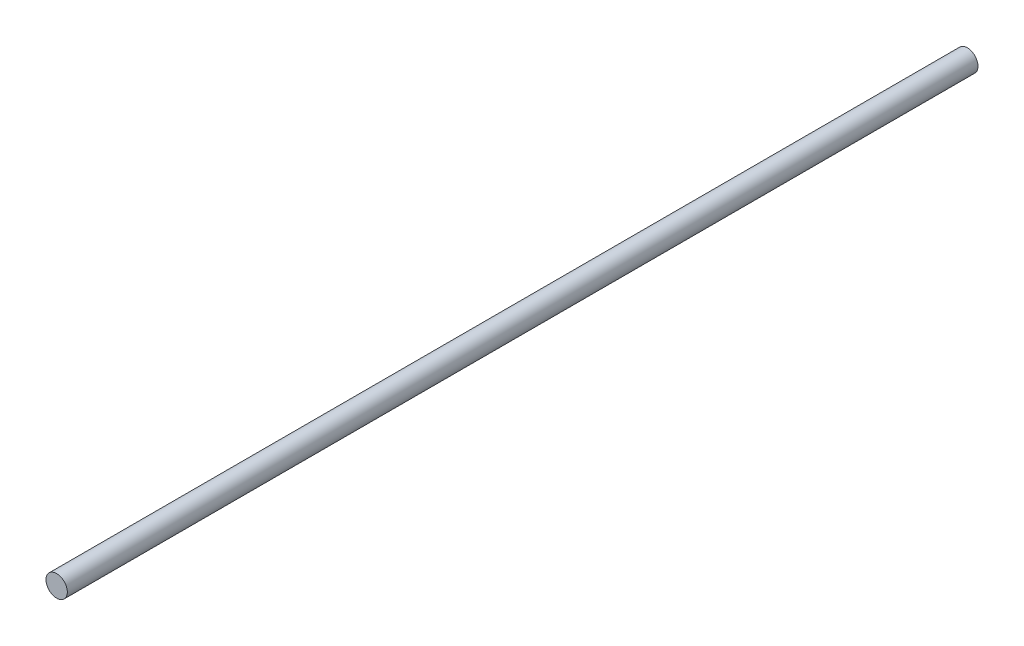
ISO-10303-21;
HEADER;
FILE_DESCRIPTION(('STEP AP214'),'2;1');
FILE_NAME('part.step','',(''),(''),'','','');
FILE_SCHEMA(('AUTOMOTIVE_DESIGN { 1 0 10303 214 1 1 1 1 }'));
ENDSEC;
DATA;
#1=APPLICATION_CONTEXT('core data for automotive mechanical design processes');
#2=APPLICATION_PROTOCOL_DEFINITION('international standard','automotive_design',2000,#1);
#3=PRODUCT_CONTEXT('',#1,'mechanical');
#4=PRODUCT('Part','Part','',(#3));
#5=PRODUCT_RELATED_PRODUCT_CATEGORY('part','',(#4));
#6=PRODUCT_DEFINITION_FORMATION('','',#4);
#7=PRODUCT_DEFINITION_CONTEXT('part definition',#1,'design');
#8=PRODUCT_DEFINITION('design','',#6,#7);
#9=PRODUCT_DEFINITION_SHAPE('','',#8);
#10=(LENGTH_UNIT() NAMED_UNIT(*) SI_UNIT(.MILLI.,.METRE.));
#11=(NAMED_UNIT(*) PLANE_ANGLE_UNIT() SI_UNIT($,.RADIAN.));
#12=(NAMED_UNIT(*) SI_UNIT($,.STERADIAN.) SOLID_ANGLE_UNIT());
#13=UNCERTAINTY_MEASURE_WITH_UNIT(LENGTH_MEASURE(1.E-05),#10,'distance_accuracy_value','');
#14=(GEOMETRIC_REPRESENTATION_CONTEXT(3) GLOBAL_UNCERTAINTY_ASSIGNED_CONTEXT((#13)) GLOBAL_UNIT_ASSIGNED_CONTEXT((#10,
#11,#12)) REPRESENTATION_CONTEXT('',''));
#15=CARTESIAN_POINT('',(0.,0.,0.));
#16=DIRECTION('',(0.,0.,1.));
#17=DIRECTION('',(1.,0.,0.));
#18=AXIS2_PLACEMENT_3D('',#15,#16,#17);
#19=CARTESIAN_POINT('',(0.,0.,128.));
#20=DIRECTION('',(0.,0.,-1.));
#21=DIRECTION('',(-1.,0.,0.));
#22=AXIS2_PLACEMENT_3D('',#19,#20,#21);
#23=CYLINDRICAL_SURFACE('',#22,1.5);
#24=CARTESIAN_POINT('',(0.,0.,128.));
#25=DIRECTION('',(0.,0.,1.));
#26=DIRECTION('',(1.,0.,0.));
#27=AXIS2_PLACEMENT_3D('',#24,#25,#26);
#28=CIRCLE('',#27,1.5);
#29=CARTESIAN_POINT('',(1.5,0.,128.));
#30=VERTEX_POINT('',#29);
#31=EDGE_CURVE('E10',#30,#30,#28,.T.);
#32=ORIENTED_EDGE('',*,*,#31,.F.);
#33=EDGE_LOOP('',(#32));
#34=FACE_BOUND('',#33,.T.);
#35=CARTESIAN_POINT('',(0.,0.,0.));
#36=DIRECTION('',(0.,0.,1.));
#37=DIRECTION('',(1.,0.,0.));
#38=AXIS2_PLACEMENT_3D('',#35,#36,#37);
#39=CIRCLE('',#38,1.5);
#40=CARTESIAN_POINT('',(1.5,0.,0.));
#41=VERTEX_POINT('',#40);
#42=EDGE_CURVE('E31',#41,#41,#39,.T.);
#43=ORIENTED_EDGE('',*,*,#42,.T.);
#44=EDGE_LOOP('',(#43));
#45=FACE_BOUND('',#44,.T.);
#46=ADVANCED_FACE('F28',(#34,#45),#23,.T.);
#47=CARTESIAN_POINT('',(0.,0.,128.));
#48=DIRECTION('',(0.,0.,1.));
#49=DIRECTION('',(1.,0.,0.));
#50=AXIS2_PLACEMENT_3D('',#47,#48,#49);
#51=PLANE('',#50);
#52=ORIENTED_EDGE('',*,*,#31,.T.);
#53=EDGE_LOOP('',(#52));
#54=FACE_BOUND('',#53,.T.);
#55=ADVANCED_FACE('F43',(#54),#51,.T.);
#56=CARTESIAN_POINT('',(0.,0.,0.));
#57=DIRECTION('',(0.,0.,1.));
#58=DIRECTION('',(1.,0.,0.));
#59=AXIS2_PLACEMENT_3D('',#56,#57,#58);
#60=PLANE('',#59);
#61=ORIENTED_EDGE('',*,*,#42,.F.);
#62=EDGE_LOOP('',(#61));
#63=FACE_BOUND('',#62,.T.);
#64=ADVANCED_FACE('F41',(#63),#60,.F.);
#65=CLOSED_SHELL('',(#46,#55,#64));
#66=MANIFOLD_SOLID_BREP('B2',#65);
#67=ADVANCED_BREP_SHAPE_REPRESENTATION('',(#18,#66),#14);
#68=SHAPE_DEFINITION_REPRESENTATION(#9,#67);
ENDSEC;
END-ISO-10303-21;
